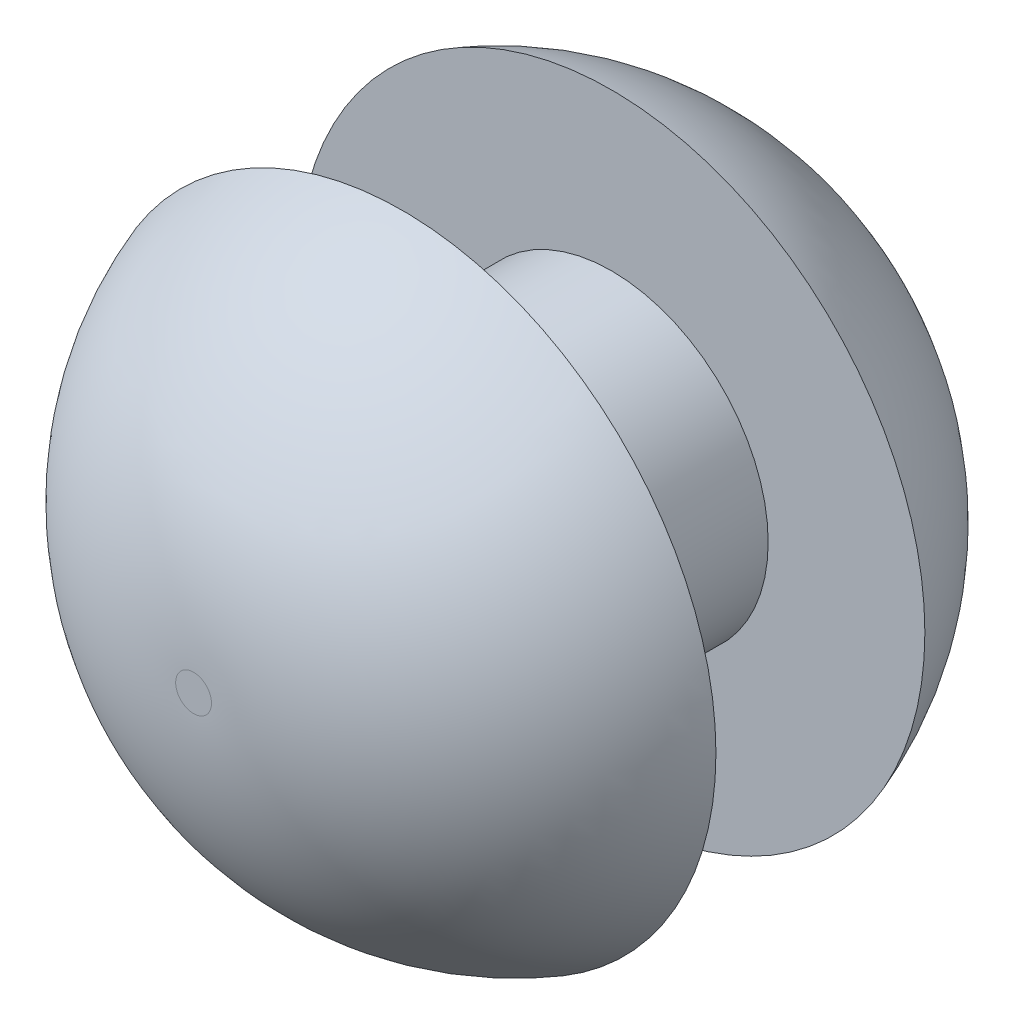
ISO-10303-21;
HEADER;
FILE_DESCRIPTION(('STEP AP214'),'2;1');
FILE_NAME('part.step','',(''),(''),'','','');
FILE_SCHEMA(('AUTOMOTIVE_DESIGN { 1 0 10303 214 1 1 1 1 }'));
ENDSEC;
DATA;
#1=APPLICATION_CONTEXT('core data for automotive mechanical design processes');
#2=APPLICATION_PROTOCOL_DEFINITION('international standard','automotive_design',2000,#1);
#3=PRODUCT_CONTEXT('',#1,'mechanical');
#4=PRODUCT('Part','Part','',(#3));
#5=PRODUCT_RELATED_PRODUCT_CATEGORY('part','',(#4));
#6=PRODUCT_DEFINITION_FORMATION('','',#4);
#7=PRODUCT_DEFINITION_CONTEXT('part definition',#1,'design');
#8=PRODUCT_DEFINITION('design','',#6,#7);
#9=PRODUCT_DEFINITION_SHAPE('','',#8);
#10=(LENGTH_UNIT() NAMED_UNIT(*) SI_UNIT(.MILLI.,.METRE.));
#11=(NAMED_UNIT(*) PLANE_ANGLE_UNIT() SI_UNIT($,.RADIAN.));
#12=(NAMED_UNIT(*) SI_UNIT($,.STERADIAN.) SOLID_ANGLE_UNIT());
#13=UNCERTAINTY_MEASURE_WITH_UNIT(LENGTH_MEASURE(1.E-05),#10,'distance_accuracy_value','');
#14=(GEOMETRIC_REPRESENTATION_CONTEXT(3) GLOBAL_UNCERTAINTY_ASSIGNED_CONTEXT((#13)) GLOBAL_UNIT_ASSIGNED_CONTEXT((#10,
#11,#12)) REPRESENTATION_CONTEXT('',''));
#15=CARTESIAN_POINT('',(0.,0.,0.));
#16=DIRECTION('',(0.,0.,1.));
#17=DIRECTION('',(1.,0.,0.));
#18=AXIS2_PLACEMENT_3D('',#15,#16,#17);
#19=CARTESIAN_POINT('',(0.,0.,0.1));
#20=DIRECTION('',(0.,0.,-1.));
#21=DIRECTION('',(-1.,0.,0.));
#22=AXIS2_PLACEMENT_3D('',#19,#20,#21);
#23=CYLINDRICAL_SURFACE('',#22,0.15);
#24=CARTESIAN_POINT('',(0.,0.,0.1));
#25=DIRECTION('',(0.,0.,1.));
#26=DIRECTION('',(1.,0.,0.));
#27=AXIS2_PLACEMENT_3D('',#24,#25,#26);
#28=CIRCLE('',#27,0.15);
#29=CARTESIAN_POINT('',(0.15,0.,0.1));
#30=VERTEX_POINT('',#29);
#31=EDGE_CURVE('E45',#30,#30,#28,.T.);
#32=ORIENTED_EDGE('',*,*,#31,.F.);
#33=EDGE_LOOP('',(#32));
#34=FACE_BOUND('',#33,.T.);
#35=CARTESIAN_POINT('',(0.,0.,-0.1));
#36=DIRECTION('',(0.,0.,1.));
#37=DIRECTION('',(1.,0.,0.));
#38=AXIS2_PLACEMENT_3D('',#35,#36,#37);
#39=CIRCLE('',#38,0.15);
#40=CARTESIAN_POINT('',(0.15,0.,-0.1));
#41=VERTEX_POINT('',#40);
#42=EDGE_CURVE('E61',#41,#41,#39,.T.);
#43=ORIENTED_EDGE('',*,*,#42,.T.);
#44=EDGE_LOOP('',(#43));
#45=FACE_BOUND('',#44,.T.);
#46=ADVANCED_FACE('F37',(#34,#45),#23,.T.);
#47=CARTESIAN_POINT('',(0.,0.,0.3));
#48=DIRECTION('',(0.,0.,1.));
#49=DIRECTION('',(1.,0.,0.));
#50=AXIS2_PLACEMENT_3D('',#47,#48,#49);
#51=PLANE('',#50);
#52=CARTESIAN_POINT('',(0.,0.,0.3));
#53=DIRECTION('',(0.,0.,1.));
#54=DIRECTION('',(1.,0.,0.));
#55=AXIS2_PLACEMENT_3D('',#52,#53,#54);
#56=CIRCLE('',#55,0.017157287525381);
#57=CARTESIAN_POINT('',(0.017157287525381,0.,0.3));
#58=VERTEX_POINT('',#57);
#59=EDGE_CURVE('E10',#58,#58,#56,.T.);
#60=ORIENTED_EDGE('',*,*,#59,.T.);
#61=EDGE_LOOP('',(#60));
#62=FACE_BOUND('',#61,.T.);
#63=ADVANCED_FACE('F90',(#62),#51,.T.);
#64=CARTESIAN_POINT('',(0.,0.,0.1));
#65=DIRECTION('',(0.,0.,1.));
#66=DIRECTION('',(1.,0.,0.));
#67=AXIS2_PLACEMENT_3D('',#64,#65,#66);
#68=PLANE('',#67);
#69=ORIENTED_EDGE('',*,*,#31,.T.);
#70=EDGE_LOOP('',(#69));
#71=FACE_BOUND('',#70,.T.);
#72=CARTESIAN_POINT('',(0.,0.,0.1));
#73=DIRECTION('',(0.,0.,1.));
#74=DIRECTION('',(1.,0.,0.));
#75=AXIS2_PLACEMENT_3D('',#72,#73,#74);
#76=CIRCLE('',#75,0.3);
#77=CARTESIAN_POINT('',(0.3,0.,0.1));
#78=VERTEX_POINT('',#77);
#79=EDGE_CURVE('E50',#78,#78,#76,.T.);
#80=ORIENTED_EDGE('',*,*,#79,.F.);
#81=EDGE_LOOP('',(#80));
#82=FACE_BOUND('',#81,.T.);
#83=ADVANCED_FACE('F87',(#71,#82),#68,.F.);
#84=CARTESIAN_POINT('',(0.,0.,0.));
#85=DIRECTION('',(0.,0.,-1.));
#86=DIRECTION('',(-1.,0.,0.));
#87=AXIS2_PLACEMENT_3D('',#84,#85,#86);
#88=DEGENERATE_TOROIDAL_SURFACE('',#87,0.017157287525381,0.3,.T.);
#89=ORIENTED_EDGE('',*,*,#79,.T.);
#90=EDGE_LOOP('',(#89));
#91=FACE_BOUND('',#90,.T.);
#92=ORIENTED_EDGE('',*,*,#59,.F.);
#93=EDGE_LOOP('',(#92));
#94=FACE_BOUND('',#93,.T.);
#95=ADVANCED_FACE('F39',(#91,#94),#88,.T.);
#96=CARTESIAN_POINT('',(0.,0.,-0.3));
#97=DIRECTION('',(0.,0.,-1.));
#98=DIRECTION('',(1.,0.,0.));
#99=AXIS2_PLACEMENT_3D('',#96,#97,#98);
#100=PLANE('',#99);
#101=CARTESIAN_POINT('',(0.,0.,-0.3));
#102=DIRECTION('',(0.,0.,1.));
#103=DIRECTION('',(1.,0.,0.));
#104=AXIS2_PLACEMENT_3D('',#101,#102,#103);
#105=CIRCLE('',#104,0.017157287525381);
#106=CARTESIAN_POINT('',(0.017157287525381,0.,-0.3));
#107=VERTEX_POINT('',#106);
#108=EDGE_CURVE('E55',#107,#107,#105,.T.);
#109=ORIENTED_EDGE('',*,*,#108,.F.);
#110=EDGE_LOOP('',(#109));
#111=FACE_BOUND('',#110,.T.);
#112=ADVANCED_FACE('F78',(#111),#100,.T.);
#113=CARTESIAN_POINT('',(0.,0.,-0.1));
#114=DIRECTION('',(0.,0.,-1.));
#115=DIRECTION('',(1.,0.,0.));
#116=AXIS2_PLACEMENT_3D('',#113,#114,#115);
#117=PLANE('',#116);
#118=ORIENTED_EDGE('',*,*,#42,.F.);
#119=EDGE_LOOP('',(#118));
#120=FACE_BOUND('',#119,.T.);
#121=CARTESIAN_POINT('',(0.,0.,-0.1));
#122=DIRECTION('',(0.,0.,1.));
#123=DIRECTION('',(1.,0.,0.));
#124=AXIS2_PLACEMENT_3D('',#121,#122,#123);
#125=CIRCLE('',#124,0.3);
#126=CARTESIAN_POINT('',(0.3,0.,-0.1));
#127=VERTEX_POINT('',#126);
#128=EDGE_CURVE('E65',#127,#127,#125,.T.);
#129=ORIENTED_EDGE('',*,*,#128,.T.);
#130=EDGE_LOOP('',(#129));
#131=FACE_BOUND('',#130,.T.);
#132=ADVANCED_FACE('F70',(#120,#131),#117,.F.);
#133=CARTESIAN_POINT('',(0.,0.,0.));
#134=DIRECTION('',(0.,0.,1.));
#135=DIRECTION('',(-1.,0.,0.));
#136=AXIS2_PLACEMENT_3D('',#133,#134,#135);
#137=DEGENERATE_TOROIDAL_SURFACE('',#136,0.017157287525381,0.3,.T.);
#138=ORIENTED_EDGE('',*,*,#128,.F.);
#139=EDGE_LOOP('',(#138));
#140=FACE_BOUND('',#139,.T.);
#141=ORIENTED_EDGE('',*,*,#108,.T.);
#142=EDGE_LOOP('',(#141));
#143=FACE_BOUND('',#142,.T.);
#144=ADVANCED_FACE('F72',(#140,#143),#137,.T.);
#145=CLOSED_SHELL('',(#46,#63,#83,#95,#112,#132,#144));
#146=MANIFOLD_SOLID_BREP('B2',#145);
#147=ADVANCED_BREP_SHAPE_REPRESENTATION('',(#18,#146),#14);
#148=SHAPE_DEFINITION_REPRESENTATION(#9,#147);
ENDSEC;
END-ISO-10303-21;
